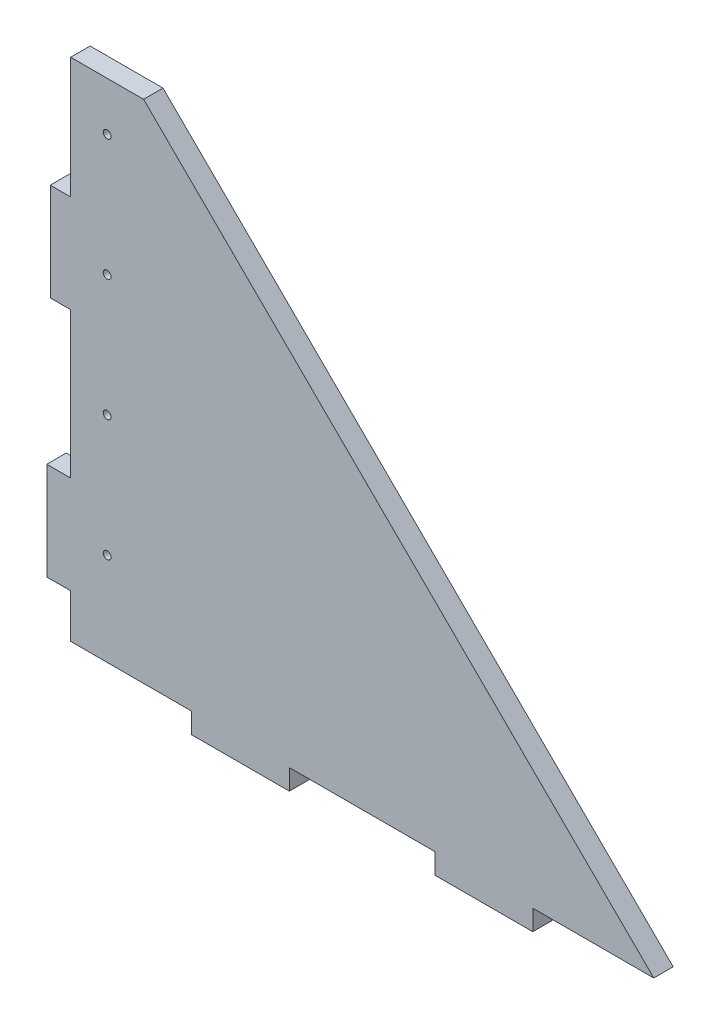
ISO-10303-21;
HEADER;
FILE_DESCRIPTION(('STEP AP214'),'2;1');
FILE_NAME('part.step','',(''),(''),'','','');
FILE_SCHEMA(('AUTOMOTIVE_DESIGN { 1 0 10303 214 1 1 1 1 }'));
ENDSEC;
DATA;
#1=APPLICATION_CONTEXT('core data for automotive mechanical design processes');
#2=APPLICATION_PROTOCOL_DEFINITION('international standard','automotive_design',2000,#1);
#3=PRODUCT_CONTEXT('',#1,'mechanical');
#4=PRODUCT('Part','Part','',(#3));
#5=PRODUCT_RELATED_PRODUCT_CATEGORY('part','',(#4));
#6=PRODUCT_DEFINITION_FORMATION('','',#4);
#7=PRODUCT_DEFINITION_CONTEXT('part definition',#1,'design');
#8=PRODUCT_DEFINITION('design','',#6,#7);
#9=PRODUCT_DEFINITION_SHAPE('','',#8);
#10=(LENGTH_UNIT() NAMED_UNIT(*) SI_UNIT(.MILLI.,.METRE.));
#11=(NAMED_UNIT(*) PLANE_ANGLE_UNIT() SI_UNIT($,.RADIAN.));
#12=(NAMED_UNIT(*) SI_UNIT($,.STERADIAN.) SOLID_ANGLE_UNIT());
#13=UNCERTAINTY_MEASURE_WITH_UNIT(LENGTH_MEASURE(1.E-05),#10,'distance_accuracy_value','');
#14=(GEOMETRIC_REPRESENTATION_CONTEXT(3) GLOBAL_UNCERTAINTY_ASSIGNED_CONTEXT((#13)) GLOBAL_UNIT_ASSIGNED_CONTEXT((#10,
#11,#12)) REPRESENTATION_CONTEXT('',''));
#15=CARTESIAN_POINT('',(0.,0.,0.));
#16=DIRECTION('',(0.,0.,1.));
#17=DIRECTION('',(1.,0.,0.));
#18=AXIS2_PLACEMENT_3D('',#15,#16,#17);
#19=CARTESIAN_POINT('',(0.,0.,4.));
#20=DIRECTION('',(0.,1.,0.));
#21=DIRECTION('',(0.,0.,1.));
#22=AXIS2_PLACEMENT_3D('',#19,#20,#21);
#23=PLANE('',#22);
#24=DIRECTION('',(1.,0.,0.));
#25=VECTOR('',#24,1.);
#26=CARTESIAN_POINT('',(0.,0.,0.));
#27=LINE('',#26,#25);
#28=CARTESIAN_POINT('',(0.,0.,0.));
#29=VERTEX_POINT('',#28);
#30=CARTESIAN_POINT('',(24.9,0.,0.));
#31=VERTEX_POINT('',#30);
#32=EDGE_CURVE('E204',#29,#31,#27,.T.);
#33=ORIENTED_EDGE('',*,*,#32,.T.);
#34=DIRECTION('',(0.,0.,-1.));
#35=VECTOR('',#34,1.);
#36=CARTESIAN_POINT('',(24.9,0.,4.));
#37=LINE('',#36,#35);
#38=CARTESIAN_POINT('',(24.9,0.,4.));
#39=VERTEX_POINT('',#38);
#40=EDGE_CURVE('E292',#39,#31,#37,.T.);
#41=ORIENTED_EDGE('',*,*,#40,.F.);
#42=DIRECTION('',(1.,0.,0.));
#43=VECTOR('',#42,1.);
#44=CARTESIAN_POINT('',(0.,0.,4.));
#45=LINE('',#44,#43);
#46=CARTESIAN_POINT('',(0.,0.,4.));
#47=VERTEX_POINT('',#46);
#48=EDGE_CURVE('E243',#47,#39,#45,.T.);
#49=ORIENTED_EDGE('',*,*,#48,.F.);
#50=DIRECTION('',(0.,0.,-1.));
#51=VECTOR('',#50,1.);
#52=CARTESIAN_POINT('',(0.,0.,4.));
#53=LINE('',#52,#51);
#54=EDGE_CURVE('E200',#47,#29,#53,.T.);
#55=ORIENTED_EDGE('',*,*,#54,.T.);
#56=EDGE_LOOP('',(#33,#41,#49,#55));
#57=FACE_BOUND('',#56,.T.);
#58=ADVANCED_FACE('F33',(#57),#23,.F.);
#59=CARTESIAN_POINT('',(24.9,-4.2,4.));
#60=DIRECTION('',(1.,0.,0.));
#61=DIRECTION('',(0.,0.,-1.));
#62=AXIS2_PLACEMENT_3D('',#59,#60,#61);
#63=PLANE('',#62);
#64=DIRECTION('',(0.,-1.,0.));
#65=VECTOR('',#64,1.);
#66=CARTESIAN_POINT('',(24.9,-4.2,0.));
#67=LINE('',#66,#65);
#68=CARTESIAN_POINT('',(24.9,-4.2,0.));
#69=VERTEX_POINT('',#68);
#70=EDGE_CURVE('E207',#31,#69,#67,.T.);
#71=ORIENTED_EDGE('',*,*,#70,.T.);
#72=DIRECTION('',(0.,0.,-1.));
#73=VECTOR('',#72,1.);
#74=CARTESIAN_POINT('',(24.9,-4.2,4.));
#75=LINE('',#74,#73);
#76=CARTESIAN_POINT('',(24.9,-4.2,4.));
#77=VERTEX_POINT('',#76);
#78=EDGE_CURVE('E289',#77,#69,#75,.T.);
#79=ORIENTED_EDGE('',*,*,#78,.F.);
#80=DIRECTION('',(0.,-1.,0.));
#81=VECTOR('',#80,1.);
#82=CARTESIAN_POINT('',(24.9,-4.2,4.));
#83=LINE('',#82,#81);
#84=EDGE_CURVE('E130',#39,#77,#83,.T.);
#85=ORIENTED_EDGE('',*,*,#84,.F.);
#86=ORIENTED_EDGE('',*,*,#40,.T.);
#87=EDGE_LOOP('',(#71,#79,#85,#86));
#88=FACE_BOUND('',#87,.T.);
#89=ADVANCED_FACE('F326',(#88),#63,.F.);
#90=CARTESIAN_POINT('',(24.9,-4.2,4.));
#91=DIRECTION('',(0.,1.,0.));
#92=DIRECTION('',(0.,0.,1.));
#93=AXIS2_PLACEMENT_3D('',#90,#91,#92);
#94=PLANE('',#93);
#95=DIRECTION('',(1.,0.,0.));
#96=VECTOR('',#95,1.);
#97=CARTESIAN_POINT('',(24.9,-4.2,0.));
#98=LINE('',#97,#96);
#99=CARTESIAN_POINT('',(45.,-4.2,0.));
#100=VERTEX_POINT('',#99);
#101=EDGE_CURVE('E210',#69,#100,#98,.T.);
#102=ORIENTED_EDGE('',*,*,#101,.T.);
#103=DIRECTION('',(0.,0.,-1.));
#104=VECTOR('',#103,1.);
#105=CARTESIAN_POINT('',(45.,-4.2,4.));
#106=LINE('',#105,#104);
#107=CARTESIAN_POINT('',(45.,-4.2,4.));
#108=VERTEX_POINT('',#107);
#109=EDGE_CURVE('E286',#108,#100,#106,.T.);
#110=ORIENTED_EDGE('',*,*,#109,.F.);
#111=DIRECTION('',(1.,0.,0.));
#112=VECTOR('',#111,1.);
#113=CARTESIAN_POINT('',(24.9,-4.2,4.));
#114=LINE('',#113,#112);
#115=EDGE_CURVE('E367',#77,#108,#114,.T.);
#116=ORIENTED_EDGE('',*,*,#115,.F.);
#117=ORIENTED_EDGE('',*,*,#78,.T.);
#118=EDGE_LOOP('',(#102,#110,#116,#117));
#119=FACE_BOUND('',#118,.T.);
#120=ADVANCED_FACE('F332',(#119),#94,.F.);
#121=CARTESIAN_POINT('',(45.,-4.2,4.));
#122=DIRECTION('',(-1.,0.,0.));
#123=DIRECTION('',(0.,-1.,0.));
#124=AXIS2_PLACEMENT_3D('',#121,#122,#123);
#125=PLANE('',#124);
#126=DIRECTION('',(0.,1.,0.));
#127=VECTOR('',#126,1.);
#128=CARTESIAN_POINT('',(45.,-4.2,0.));
#129=LINE('',#128,#127);
#130=CARTESIAN_POINT('',(45.,0.,0.));
#131=VERTEX_POINT('',#130);
#132=EDGE_CURVE('E212',#100,#131,#129,.T.);
#133=ORIENTED_EDGE('',*,*,#132,.T.);
#134=DIRECTION('',(0.,0.,-1.));
#135=VECTOR('',#134,1.);
#136=CARTESIAN_POINT('',(45.,0.,4.));
#137=LINE('',#136,#135);
#138=CARTESIAN_POINT('',(45.,0.,4.));
#139=VERTEX_POINT('',#138);
#140=EDGE_CURVE('E283',#139,#131,#137,.T.);
#141=ORIENTED_EDGE('',*,*,#140,.F.);
#142=DIRECTION('',(0.,1.,0.));
#143=VECTOR('',#142,1.);
#144=CARTESIAN_POINT('',(45.,-4.2,4.));
#145=LINE('',#144,#143);
#146=EDGE_CURVE('E369',#108,#139,#145,.T.);
#147=ORIENTED_EDGE('',*,*,#146,.F.);
#148=ORIENTED_EDGE('',*,*,#109,.T.);
#149=EDGE_LOOP('',(#133,#141,#147,#148));
#150=FACE_BOUND('',#149,.T.);
#151=ADVANCED_FACE('F416',(#150),#125,.F.);
#152=CARTESIAN_POINT('',(45.,0.,4.));
#153=DIRECTION('',(0.,1.,0.));
#154=DIRECTION('',(0.,0.,1.));
#155=AXIS2_PLACEMENT_3D('',#152,#153,#154);
#156=PLANE('',#155);
#157=DIRECTION('',(1.,0.,0.));
#158=VECTOR('',#157,1.);
#159=CARTESIAN_POINT('',(45.,0.,0.));
#160=LINE('',#159,#158);
#161=CARTESIAN_POINT('',(75.,0.,0.));
#162=VERTEX_POINT('',#161);
#163=EDGE_CURVE('E214',#131,#162,#160,.T.);
#164=ORIENTED_EDGE('',*,*,#163,.T.);
#165=DIRECTION('',(0.,0.,-1.));
#166=VECTOR('',#165,1.);
#167=CARTESIAN_POINT('',(75.,0.,4.));
#168=LINE('',#167,#166);
#169=CARTESIAN_POINT('',(75.,0.,4.));
#170=VERTEX_POINT('',#169);
#171=EDGE_CURVE('E280',#170,#162,#168,.T.);
#172=ORIENTED_EDGE('',*,*,#171,.F.);
#173=DIRECTION('',(1.,0.,0.));
#174=VECTOR('',#173,1.);
#175=CARTESIAN_POINT('',(45.,0.,4.));
#176=LINE('',#175,#174);
#177=EDGE_CURVE('E371',#139,#170,#176,.T.);
#178=ORIENTED_EDGE('',*,*,#177,.F.);
#179=ORIENTED_EDGE('',*,*,#140,.T.);
#180=EDGE_LOOP('',(#164,#172,#178,#179));
#181=FACE_BOUND('',#180,.T.);
#182=ADVANCED_FACE('F422',(#181),#156,.F.);
#183=CARTESIAN_POINT('',(75.,0.,4.));
#184=DIRECTION('',(1.,0.,0.));
#185=DIRECTION('',(0.,0.,-1.));
#186=AXIS2_PLACEMENT_3D('',#183,#184,#185);
#187=PLANE('',#186);
#188=DIRECTION('',(0.,-1.,0.));
#189=VECTOR('',#188,1.);
#190=CARTESIAN_POINT('',(75.,0.,0.));
#191=LINE('',#190,#189);
#192=CARTESIAN_POINT('',(75.,-4.2,0.));
#193=VERTEX_POINT('',#192);
#194=EDGE_CURVE('E216',#162,#193,#191,.T.);
#195=ORIENTED_EDGE('',*,*,#194,.T.);
#196=DIRECTION('',(0.,0.,-1.));
#197=VECTOR('',#196,1.);
#198=CARTESIAN_POINT('',(75.,-4.2,4.));
#199=LINE('',#198,#197);
#200=CARTESIAN_POINT('',(75.,-4.2,4.));
#201=VERTEX_POINT('',#200);
#202=EDGE_CURVE('E277',#201,#193,#199,.T.);
#203=ORIENTED_EDGE('',*,*,#202,.F.);
#204=DIRECTION('',(0.,-1.,0.));
#205=VECTOR('',#204,1.);
#206=CARTESIAN_POINT('',(75.,0.,4.));
#207=LINE('',#206,#205);
#208=EDGE_CURVE('E373',#170,#201,#207,.T.);
#209=ORIENTED_EDGE('',*,*,#208,.F.);
#210=ORIENTED_EDGE('',*,*,#171,.T.);
#211=EDGE_LOOP('',(#195,#203,#209,#210));
#212=FACE_BOUND('',#211,.T.);
#213=ADVANCED_FACE('F426',(#212),#187,.F.);
#214=CARTESIAN_POINT('',(75.,-4.2,4.));
#215=DIRECTION('',(0.,1.,0.));
#216=DIRECTION('',(-1.,0.,0.));
#217=AXIS2_PLACEMENT_3D('',#214,#215,#216);
#218=PLANE('',#217);
#219=DIRECTION('',(1.,0.,0.));
#220=VECTOR('',#219,1.);
#221=CARTESIAN_POINT('',(75.,-4.2,0.));
#222=LINE('',#221,#220);
#223=CARTESIAN_POINT('',(95.1,-4.2,0.));
#224=VERTEX_POINT('',#223);
#225=EDGE_CURVE('E218',#193,#224,#222,.T.);
#226=ORIENTED_EDGE('',*,*,#225,.T.);
#227=DIRECTION('',(0.,0.,-1.));
#228=VECTOR('',#227,1.);
#229=CARTESIAN_POINT('',(95.1,-4.2,4.));
#230=LINE('',#229,#228);
#231=CARTESIAN_POINT('',(95.1,-4.2,4.));
#232=VERTEX_POINT('',#231);
#233=EDGE_CURVE('E274',#232,#224,#230,.T.);
#234=ORIENTED_EDGE('',*,*,#233,.F.);
#235=DIRECTION('',(1.,0.,0.));
#236=VECTOR('',#235,1.);
#237=CARTESIAN_POINT('',(75.,-4.2,4.));
#238=LINE('',#237,#236);
#239=EDGE_CURVE('E375',#201,#232,#238,.T.);
#240=ORIENTED_EDGE('',*,*,#239,.F.);
#241=ORIENTED_EDGE('',*,*,#202,.T.);
#242=EDGE_LOOP('',(#226,#234,#240,#241));
#243=FACE_BOUND('',#242,.T.);
#244=ADVANCED_FACE('F431',(#243),#218,.F.);
#245=CARTESIAN_POINT('',(95.1,0.,4.));
#246=DIRECTION('',(-1.,0.,0.));
#247=DIRECTION('',(0.,0.,1.));
#248=AXIS2_PLACEMENT_3D('',#245,#246,#247);
#249=PLANE('',#248);
#250=DIRECTION('',(0.,1.,0.));
#251=VECTOR('',#250,1.);
#252=CARTESIAN_POINT('',(95.1,0.,0.));
#253=LINE('',#252,#251);
#254=CARTESIAN_POINT('',(95.1,0.,0.));
#255=VERTEX_POINT('',#254);
#256=EDGE_CURVE('E220',#224,#255,#253,.T.);
#257=ORIENTED_EDGE('',*,*,#256,.T.);
#258=DIRECTION('',(0.,0.,-1.));
#259=VECTOR('',#258,1.);
#260=CARTESIAN_POINT('',(95.1,0.,4.));
#261=LINE('',#260,#259);
#262=CARTESIAN_POINT('',(95.1,0.,4.));
#263=VERTEX_POINT('',#262);
#264=EDGE_CURVE('E271',#263,#255,#261,.T.);
#265=ORIENTED_EDGE('',*,*,#264,.F.);
#266=DIRECTION('',(0.,1.,0.));
#267=VECTOR('',#266,1.);
#268=CARTESIAN_POINT('',(95.1,0.,4.));
#269=LINE('',#268,#267);
#270=EDGE_CURVE('E377',#232,#263,#269,.T.);
#271=ORIENTED_EDGE('',*,*,#270,.F.);
#272=ORIENTED_EDGE('',*,*,#233,.T.);
#273=EDGE_LOOP('',(#257,#265,#271,#272));
#274=FACE_BOUND('',#273,.T.);
#275=ADVANCED_FACE('F437',(#274),#249,.F.);
#276=CARTESIAN_POINT('',(95.1,0.,4.));
#277=DIRECTION('',(0.,1.,0.));
#278=DIRECTION('',(-1.,0.,0.));
#279=AXIS2_PLACEMENT_3D('',#276,#277,#278);
#280=PLANE('',#279);
#281=DIRECTION('',(1.,0.,0.));
#282=VECTOR('',#281,1.);
#283=CARTESIAN_POINT('',(95.1,0.,0.));
#284=LINE('',#283,#282);
#285=CARTESIAN_POINT('',(120.,0.,0.));
#286=VERTEX_POINT('',#285);
#287=EDGE_CURVE('E222',#255,#286,#284,.T.);
#288=ORIENTED_EDGE('',*,*,#287,.T.);
#289=DIRECTION('',(0.,0.,-1.));
#290=VECTOR('',#289,1.);
#291=CARTESIAN_POINT('',(120.,0.,4.));
#292=LINE('',#291,#290);
#293=CARTESIAN_POINT('',(120.,0.,4.));
#294=VERTEX_POINT('',#293);
#295=EDGE_CURVE('E268',#294,#286,#292,.T.);
#296=ORIENTED_EDGE('',*,*,#295,.F.);
#297=DIRECTION('',(1.,0.,0.));
#298=VECTOR('',#297,1.);
#299=CARTESIAN_POINT('',(95.1,0.,4.));
#300=LINE('',#299,#298);
#301=EDGE_CURVE('E379',#263,#294,#300,.T.);
#302=ORIENTED_EDGE('',*,*,#301,.F.);
#303=ORIENTED_EDGE('',*,*,#264,.T.);
#304=EDGE_LOOP('',(#288,#296,#302,#303));
#305=FACE_BOUND('',#304,.T.);
#306=ADVANCED_FACE('F441',(#305),#280,.F.);
#307=CARTESIAN_POINT('',(15.,104.11,4.));
#308=DIRECTION('',(-0.704090863426999,-0.710109890114638,0.));
#309=DIRECTION('',(0.710109890114638,-0.704090863426999,0.));
#310=AXIS2_PLACEMENT_3D('',#307,#308,#309);
#311=PLANE('',#310);
#312=DIRECTION('',(-0.710109890114638,0.704090863426999,0.));
#313=VECTOR('',#312,1.);
#314=CARTESIAN_POINT('',(15.,104.11,0.));
#315=LINE('',#314,#313);
#316=CARTESIAN_POINT('',(15.,104.11,0.));
#317=VERTEX_POINT('',#316);
#318=EDGE_CURVE('E224',#286,#317,#315,.T.);
#319=ORIENTED_EDGE('',*,*,#318,.T.);
#320=DIRECTION('',(0.,0.,-1.));
#321=VECTOR('',#320,1.);
#322=CARTESIAN_POINT('',(15.,104.11,4.));
#323=LINE('',#322,#321);
#324=CARTESIAN_POINT('',(15.,104.11,4.));
#325=VERTEX_POINT('',#324);
#326=EDGE_CURVE('E265',#325,#317,#323,.T.);
#327=ORIENTED_EDGE('',*,*,#326,.F.);
#328=DIRECTION('',(-0.710109890114638,0.704090863426999,0.));
#329=VECTOR('',#328,1.);
#330=CARTESIAN_POINT('',(15.,104.11,4.));
#331=LINE('',#330,#329);
#332=EDGE_CURVE('E381',#294,#325,#331,.T.);
#333=ORIENTED_EDGE('',*,*,#332,.F.);
#334=ORIENTED_EDGE('',*,*,#295,.T.);
#335=EDGE_LOOP('',(#319,#327,#333,#334));
#336=FACE_BOUND('',#335,.T.);
#337=ADVANCED_FACE('F446',(#336),#311,.F.);
#338=CARTESIAN_POINT('',(0.,104.11,4.));
#339=DIRECTION('',(0.,-1.,0.));
#340=DIRECTION('',(0.,0.,-1.));
#341=AXIS2_PLACEMENT_3D('',#338,#339,#340);
#342=PLANE('',#341);
#343=DIRECTION('',(-1.,0.,0.));
#344=VECTOR('',#343,1.);
#345=CARTESIAN_POINT('',(0.,104.11,0.));
#346=LINE('',#345,#344);
#347=CARTESIAN_POINT('',(0.,104.11,0.));
#348=VERTEX_POINT('',#347);
#349=EDGE_CURVE('E226',#317,#348,#346,.T.);
#350=ORIENTED_EDGE('',*,*,#349,.T.);
#351=DIRECTION('',(0.,0.,-1.));
#352=VECTOR('',#351,1.);
#353=CARTESIAN_POINT('',(0.,104.11,4.));
#354=LINE('',#353,#352);
#355=CARTESIAN_POINT('',(0.,104.11,4.));
#356=VERTEX_POINT('',#355);
#357=EDGE_CURVE('E262',#356,#348,#354,.T.);
#358=ORIENTED_EDGE('',*,*,#357,.F.);
#359=DIRECTION('',(-1.,0.,0.));
#360=VECTOR('',#359,1.);
#361=CARTESIAN_POINT('',(0.,104.11,4.));
#362=LINE('',#361,#360);
#363=EDGE_CURVE('E383',#325,#356,#362,.T.);
#364=ORIENTED_EDGE('',*,*,#363,.F.);
#365=ORIENTED_EDGE('',*,*,#326,.T.);
#366=EDGE_LOOP('',(#350,#358,#364,#365));
#367=FACE_BOUND('',#366,.T.);
#368=ADVANCED_FACE('F452',(#367),#342,.F.);
#369=CARTESIAN_POINT('',(0.,79.21,4.));
#370=DIRECTION('',(1.,0.,0.));
#371=DIRECTION('',(0.,0.,-1.));
#372=AXIS2_PLACEMENT_3D('',#369,#370,#371);
#373=PLANE('',#372);
#374=DIRECTION('',(0.,-1.,0.));
#375=VECTOR('',#374,1.);
#376=CARTESIAN_POINT('',(0.,79.21,0.));
#377=LINE('',#376,#375);
#378=CARTESIAN_POINT('',(0.,79.21,0.));
#379=VERTEX_POINT('',#378);
#380=EDGE_CURVE('E228',#348,#379,#377,.T.);
#381=ORIENTED_EDGE('',*,*,#380,.T.);
#382=DIRECTION('',(0.,0.,-1.));
#383=VECTOR('',#382,1.);
#384=CARTESIAN_POINT('',(0.,79.21,4.));
#385=LINE('',#384,#383);
#386=CARTESIAN_POINT('',(0.,79.21,4.));
#387=VERTEX_POINT('',#386);
#388=EDGE_CURVE('E259',#387,#379,#385,.T.);
#389=ORIENTED_EDGE('',*,*,#388,.F.);
#390=DIRECTION('',(0.,-1.,0.));
#391=VECTOR('',#390,1.);
#392=CARTESIAN_POINT('',(0.,79.21,4.));
#393=LINE('',#392,#391);
#394=EDGE_CURVE('E385',#356,#387,#393,.T.);
#395=ORIENTED_EDGE('',*,*,#394,.F.);
#396=ORIENTED_EDGE('',*,*,#357,.T.);
#397=EDGE_LOOP('',(#381,#389,#395,#396));
#398=FACE_BOUND('',#397,.T.);
#399=ADVANCED_FACE('F456',(#398),#373,.F.);
#400=CARTESIAN_POINT('',(0.,79.21,4.));
#401=DIRECTION('',(0.,-1.,0.));
#402=DIRECTION('',(0.,0.,-1.));
#403=AXIS2_PLACEMENT_3D('',#400,#401,#402);
#404=PLANE('',#403);
#405=DIRECTION('',(-1.,0.,0.));
#406=VECTOR('',#405,1.);
#407=CARTESIAN_POINT('',(0.,79.21,0.));
#408=LINE('',#407,#406);
#409=CARTESIAN_POINT('',(-4.2,79.21,0.));
#410=VERTEX_POINT('',#409);
#411=EDGE_CURVE('E230',#379,#410,#408,.T.);
#412=ORIENTED_EDGE('',*,*,#411,.T.);
#413=DIRECTION('',(0.,0.,-1.));
#414=VECTOR('',#413,1.);
#415=CARTESIAN_POINT('',(-4.2,79.21,4.));
#416=LINE('',#415,#414);
#417=CARTESIAN_POINT('',(-4.2,79.21,4.));
#418=VERTEX_POINT('',#417);
#419=EDGE_CURVE('E256',#418,#410,#416,.T.);
#420=ORIENTED_EDGE('',*,*,#419,.F.);
#421=DIRECTION('',(-1.,0.,0.));
#422=VECTOR('',#421,1.);
#423=CARTESIAN_POINT('',(0.,79.21,4.));
#424=LINE('',#423,#422);
#425=EDGE_CURVE('E387',#387,#418,#424,.T.);
#426=ORIENTED_EDGE('',*,*,#425,.F.);
#427=ORIENTED_EDGE('',*,*,#388,.T.);
#428=EDGE_LOOP('',(#412,#420,#426,#427));
#429=FACE_BOUND('',#428,.T.);
#430=ADVANCED_FACE('F461',(#429),#404,.F.);
#431=CARTESIAN_POINT('',(-4.2,59.11,4.));
#432=DIRECTION('',(1.,0.,0.));
#433=DIRECTION('',(0.,0.,-1.));
#434=AXIS2_PLACEMENT_3D('',#431,#432,#433);
#435=PLANE('',#434);
#436=DIRECTION('',(0.,-1.,0.));
#437=VECTOR('',#436,1.);
#438=CARTESIAN_POINT('',(-4.2,59.11,0.));
#439=LINE('',#438,#437);
#440=CARTESIAN_POINT('',(-4.2,59.11,0.));
#441=VERTEX_POINT('',#440);
#442=EDGE_CURVE('E232',#410,#441,#439,.T.);
#443=ORIENTED_EDGE('',*,*,#442,.T.);
#444=DIRECTION('',(0.,0.,-1.));
#445=VECTOR('',#444,1.);
#446=CARTESIAN_POINT('',(-4.2,59.11,4.));
#447=LINE('',#446,#445);
#448=CARTESIAN_POINT('',(-4.2,59.11,4.));
#449=VERTEX_POINT('',#448);
#450=EDGE_CURVE('E253',#449,#441,#447,.T.);
#451=ORIENTED_EDGE('',*,*,#450,.F.);
#452=DIRECTION('',(0.,-1.,0.));
#453=VECTOR('',#452,1.);
#454=CARTESIAN_POINT('',(-4.2,59.11,4.));
#455=LINE('',#454,#453);
#456=EDGE_CURVE('E389',#418,#449,#455,.T.);
#457=ORIENTED_EDGE('',*,*,#456,.F.);
#458=ORIENTED_EDGE('',*,*,#419,.T.);
#459=EDGE_LOOP('',(#443,#451,#457,#458));
#460=FACE_BOUND('',#459,.T.);
#461=ADVANCED_FACE('F465',(#460),#435,.F.);
#462=CARTESIAN_POINT('',(0.,59.11,4.));
#463=DIRECTION('',(0.,1.,0.));
#464=DIRECTION('',(0.,0.,1.));
#465=AXIS2_PLACEMENT_3D('',#462,#463,#464);
#466=PLANE('',#465);
#467=DIRECTION('',(1.,0.,0.));
#468=VECTOR('',#467,1.);
#469=CARTESIAN_POINT('',(0.,59.11,0.));
#470=LINE('',#469,#468);
#471=CARTESIAN_POINT('',(0.,59.11,0.));
#472=VERTEX_POINT('',#471);
#473=EDGE_CURVE('E234',#441,#472,#470,.T.);
#474=ORIENTED_EDGE('',*,*,#473,.T.);
#475=DIRECTION('',(0.,0.,-1.));
#476=VECTOR('',#475,1.);
#477=CARTESIAN_POINT('',(0.,59.11,4.));
#478=LINE('',#477,#476);
#479=CARTESIAN_POINT('',(0.,59.11,4.));
#480=VERTEX_POINT('',#479);
#481=EDGE_CURVE('E250',#480,#472,#478,.T.);
#482=ORIENTED_EDGE('',*,*,#481,.F.);
#483=DIRECTION('',(1.,0.,0.));
#484=VECTOR('',#483,1.);
#485=CARTESIAN_POINT('',(0.,59.11,4.));
#486=LINE('',#485,#484);
#487=EDGE_CURVE('E391',#449,#480,#486,.T.);
#488=ORIENTED_EDGE('',*,*,#487,.F.);
#489=ORIENTED_EDGE('',*,*,#450,.T.);
#490=EDGE_LOOP('',(#474,#482,#488,#489));
#491=FACE_BOUND('',#490,.T.);
#492=ADVANCED_FACE('F469',(#491),#466,.F.);
#493=CARTESIAN_POINT('',(0.,29.11,4.));
#494=DIRECTION('',(1.,0.,0.));
#495=DIRECTION('',(0.,0.,-1.));
#496=AXIS2_PLACEMENT_3D('',#493,#494,#495);
#497=PLANE('',#496);
#498=DIRECTION('',(0.,-1.,0.));
#499=VECTOR('',#498,1.);
#500=CARTESIAN_POINT('',(0.,29.11,0.));
#501=LINE('',#500,#499);
#502=CARTESIAN_POINT('',(0.,29.11,0.));
#503=VERTEX_POINT('',#502);
#504=EDGE_CURVE('E236',#472,#503,#501,.T.);
#505=ORIENTED_EDGE('',*,*,#504,.T.);
#506=DIRECTION('',(0.,0.,-1.));
#507=VECTOR('',#506,1.);
#508=CARTESIAN_POINT('',(0.,29.11,4.));
#509=LINE('',#508,#507);
#510=CARTESIAN_POINT('',(0.,29.11,4.));
#511=VERTEX_POINT('',#510);
#512=EDGE_CURVE('E247',#511,#503,#509,.T.);
#513=ORIENTED_EDGE('',*,*,#512,.F.);
#514=DIRECTION('',(0.,-1.,0.));
#515=VECTOR('',#514,1.);
#516=CARTESIAN_POINT('',(0.,29.11,4.));
#517=LINE('',#516,#515);
#518=EDGE_CURVE('E393',#480,#511,#517,.T.);
#519=ORIENTED_EDGE('',*,*,#518,.F.);
#520=ORIENTED_EDGE('',*,*,#481,.T.);
#521=EDGE_LOOP('',(#505,#513,#519,#520));
#522=FACE_BOUND('',#521,.T.);
#523=ADVANCED_FACE('F399',(#522),#497,.F.);
#524=CARTESIAN_POINT('',(-4.9131679733182,29.11,4.));
#525=DIRECTION('',(0.,-1.,0.));
#526=DIRECTION('',(0.,0.,-1.));
#527=AXIS2_PLACEMENT_3D('',#524,#525,#526);
#528=PLANE('',#527);
#529=DIRECTION('',(-1.,0.,0.));
#530=VECTOR('',#529,1.);
#531=CARTESIAN_POINT('',(-4.9131679733182,29.11,0.));
#532=LINE('',#531,#530);
#533=CARTESIAN_POINT('',(-4.9131679733182,29.11,0.));
#534=VERTEX_POINT('',#533);
#535=EDGE_CURVE('E238',#503,#534,#532,.T.);
#536=ORIENTED_EDGE('',*,*,#535,.T.);
#537=DIRECTION('',(0.,0.,-1.));
#538=VECTOR('',#537,1.);
#539=CARTESIAN_POINT('',(-4.9131679733182,29.11,4.));
#540=LINE('',#539,#538);
#541=CARTESIAN_POINT('',(-4.9131679733182,29.11,4.));
#542=VERTEX_POINT('',#541);
#543=EDGE_CURVE('E195',#542,#534,#540,.T.);
#544=ORIENTED_EDGE('',*,*,#543,.F.);
#545=DIRECTION('',(-1.,0.,0.));
#546=VECTOR('',#545,1.);
#547=CARTESIAN_POINT('',(-4.9131679733182,29.11,4.));
#548=LINE('',#547,#546);
#549=EDGE_CURVE('E186',#511,#542,#548,.T.);
#550=ORIENTED_EDGE('',*,*,#549,.F.);
#551=ORIENTED_EDGE('',*,*,#512,.T.);
#552=EDGE_LOOP('',(#536,#544,#550,#551));
#553=FACE_BOUND('',#552,.T.);
#554=ADVANCED_FACE('F403',(#553),#528,.F.);
#555=CARTESIAN_POINT('',(-4.9131679733182,9.01,4.));
#556=DIRECTION('',(1.,0.,0.));
#557=DIRECTION('',(0.,0.,-1.));
#558=AXIS2_PLACEMENT_3D('',#555,#556,#557);
#559=PLANE('',#558);
#560=DIRECTION('',(0.,-1.,0.));
#561=VECTOR('',#560,1.);
#562=CARTESIAN_POINT('',(-4.9131679733182,9.01,0.));
#563=LINE('',#562,#561);
#564=CARTESIAN_POINT('',(-4.9131679733182,9.01,0.));
#565=VERTEX_POINT('',#564);
#566=EDGE_CURVE('E194',#534,#565,#563,.T.);
#567=ORIENTED_EDGE('',*,*,#566,.T.);
#568=DIRECTION('',(0.,0.,-1.));
#569=VECTOR('',#568,1.);
#570=CARTESIAN_POINT('',(-4.9131679733182,9.01,4.));
#571=LINE('',#570,#569);
#572=CARTESIAN_POINT('',(-4.9131679733182,9.01,4.));
#573=VERTEX_POINT('',#572);
#574=EDGE_CURVE('E191',#573,#565,#571,.T.);
#575=ORIENTED_EDGE('',*,*,#574,.F.);
#576=DIRECTION('',(0.,-1.,0.));
#577=VECTOR('',#576,1.);
#578=CARTESIAN_POINT('',(-4.9131679733182,9.01,4.));
#579=LINE('',#578,#577);
#580=EDGE_CURVE('E179',#542,#573,#579,.T.);
#581=ORIENTED_EDGE('',*,*,#580,.F.);
#582=ORIENTED_EDGE('',*,*,#543,.T.);
#583=EDGE_LOOP('',(#567,#575,#581,#582));
#584=FACE_BOUND('',#583,.T.);
#585=ADVANCED_FACE('F192',(#584),#559,.F.);
#586=CARTESIAN_POINT('',(-4.9131679733182,9.01,4.));
#587=DIRECTION('',(0.,1.,0.));
#588=DIRECTION('',(0.,0.,1.));
#589=AXIS2_PLACEMENT_3D('',#586,#587,#588);
#590=PLANE('',#589);
#591=DIRECTION('',(1.,0.,0.));
#592=VECTOR('',#591,1.);
#593=CARTESIAN_POINT('',(-4.9131679733182,9.01,0.));
#594=LINE('',#593,#592);
#595=CARTESIAN_POINT('',(0.,9.01,0.));
#596=VERTEX_POINT('',#595);
#597=EDGE_CURVE('E115',#565,#596,#594,.T.);
#598=ORIENTED_EDGE('',*,*,#597,.T.);
#599=DIRECTION('',(0.,0.,-1.));
#600=VECTOR('',#599,1.);
#601=CARTESIAN_POINT('',(0.,9.01,4.));
#602=LINE('',#601,#600);
#603=CARTESIAN_POINT('',(0.,9.01,4.));
#604=VERTEX_POINT('',#603);
#605=EDGE_CURVE('E196',#604,#596,#602,.T.);
#606=ORIENTED_EDGE('',*,*,#605,.F.);
#607=DIRECTION('',(1.,0.,0.));
#608=VECTOR('',#607,1.);
#609=CARTESIAN_POINT('',(-4.9131679733182,9.01,4.));
#610=LINE('',#609,#608);
#611=EDGE_CURVE('E184',#573,#604,#610,.T.);
#612=ORIENTED_EDGE('',*,*,#611,.F.);
#613=ORIENTED_EDGE('',*,*,#574,.T.);
#614=EDGE_LOOP('',(#598,#606,#612,#613));
#615=FACE_BOUND('',#614,.T.);
#616=ADVANCED_FACE('F198',(#615),#590,.F.);
#617=CARTESIAN_POINT('',(0.,0.,4.));
#618=DIRECTION('',(1.,0.,0.));
#619=DIRECTION('',(0.,0.,-1.));
#620=AXIS2_PLACEMENT_3D('',#617,#618,#619);
#621=PLANE('',#620);
#622=DIRECTION('',(0.,-1.,0.));
#623=VECTOR('',#622,1.);
#624=CARTESIAN_POINT('',(0.,0.,0.));
#625=LINE('',#624,#623);
#626=EDGE_CURVE('E121',#596,#29,#625,.T.);
#627=ORIENTED_EDGE('',*,*,#626,.T.);
#628=ORIENTED_EDGE('',*,*,#54,.F.);
#629=DIRECTION('',(0.,-1.,0.));
#630=VECTOR('',#629,1.);
#631=CARTESIAN_POINT('',(0.,0.,4.));
#632=LINE('',#631,#630);
#633=EDGE_CURVE('E50',#604,#47,#632,.T.);
#634=ORIENTED_EDGE('',*,*,#633,.F.);
#635=ORIENTED_EDGE('',*,*,#605,.T.);
#636=EDGE_LOOP('',(#627,#628,#634,#635));
#637=FACE_BOUND('',#636,.T.);
#638=ADVANCED_FACE('F310',(#637),#621,.F.);
#639=CARTESIAN_POINT('',(0.,0.,4.));
#640=DIRECTION('',(0.,0.,1.));
#641=DIRECTION('',(1.,0.,0.));
#642=AXIS2_PLACEMENT_3D('',#639,#640,#641);
#643=PLANE('',#642);
#644=CARTESIAN_POINT('',(7.5,69.11,4.));
#645=DIRECTION('',(0.,0.,1.));
#646=DIRECTION('',(1.,0.,0.));
#647=AXIS2_PLACEMENT_3D('',#644,#645,#646);
#648=CIRCLE('',#647,0.799999999999998);
#649=CARTESIAN_POINT('',(8.3,69.11,4.));
#650=VERTEX_POINT('',#649);
#651=EDGE_CURVE('E356',#650,#650,#648,.T.);
#652=ORIENTED_EDGE('',*,*,#651,.F.);
#653=EDGE_LOOP('',(#652));
#654=FACE_BOUND('',#653,.T.);
#655=CARTESIAN_POINT('',(7.5,94.11,4.));
#656=DIRECTION('',(0.,0.,1.));
#657=DIRECTION('',(1.,0.,0.));
#658=AXIS2_PLACEMENT_3D('',#655,#656,#657);
#659=CIRCLE('',#658,0.799999999999998);
#660=CARTESIAN_POINT('',(8.3,94.11,4.));
#661=VERTEX_POINT('',#660);
#662=EDGE_CURVE('E357',#661,#661,#659,.T.);
#663=ORIENTED_EDGE('',*,*,#662,.F.);
#664=EDGE_LOOP('',(#663));
#665=FACE_BOUND('',#664,.T.);
#666=ORIENTED_EDGE('',*,*,#48,.T.);
#667=ORIENTED_EDGE('',*,*,#84,.T.);
#668=ORIENTED_EDGE('',*,*,#115,.T.);
#669=ORIENTED_EDGE('',*,*,#146,.T.);
#670=ORIENTED_EDGE('',*,*,#177,.T.);
#671=ORIENTED_EDGE('',*,*,#208,.T.);
#672=ORIENTED_EDGE('',*,*,#239,.T.);
#673=ORIENTED_EDGE('',*,*,#270,.T.);
#674=ORIENTED_EDGE('',*,*,#301,.T.);
#675=ORIENTED_EDGE('',*,*,#332,.T.);
#676=ORIENTED_EDGE('',*,*,#363,.T.);
#677=ORIENTED_EDGE('',*,*,#394,.T.);
#678=ORIENTED_EDGE('',*,*,#425,.T.);
#679=ORIENTED_EDGE('',*,*,#456,.T.);
#680=ORIENTED_EDGE('',*,*,#487,.T.);
#681=ORIENTED_EDGE('',*,*,#518,.T.);
#682=ORIENTED_EDGE('',*,*,#549,.T.);
#683=ORIENTED_EDGE('',*,*,#580,.T.);
#684=ORIENTED_EDGE('',*,*,#611,.T.);
#685=ORIENTED_EDGE('',*,*,#633,.T.);
#686=EDGE_LOOP('',(#666,#667,#668,#669,#670,#671,#672,#673,#674,#675,#676,#677,#678,#679,#680,
#681,#682,#683,#684,#685));
#687=FACE_BOUND('',#686,.T.);
#688=CARTESIAN_POINT('',(7.5,44.11,4.));
#689=DIRECTION('',(0.,0.,1.));
#690=DIRECTION('',(1.,0.,0.));
#691=AXIS2_PLACEMENT_3D('',#688,#689,#690);
#692=CIRCLE('',#691,0.799999999999998);
#693=CARTESIAN_POINT('',(8.3,44.11,4.));
#694=VERTEX_POINT('',#693);
#695=EDGE_CURVE('E297',#694,#694,#692,.T.);
#696=ORIENTED_EDGE('',*,*,#695,.F.);
#697=EDGE_LOOP('',(#696));
#698=FACE_BOUND('',#697,.T.);
#699=CARTESIAN_POINT('',(7.5,19.11,4.));
#700=DIRECTION('',(0.,0.,1.));
#701=DIRECTION('',(1.,0.,0.));
#702=AXIS2_PLACEMENT_3D('',#699,#700,#701);
#703=CIRCLE('',#702,0.799999999999998);
#704=CARTESIAN_POINT('',(8.3,19.11,4.));
#705=VERTEX_POINT('',#704);
#706=EDGE_CURVE('E11',#705,#705,#703,.T.);
#707=ORIENTED_EDGE('',*,*,#706,.F.);
#708=EDGE_LOOP('',(#707));
#709=FACE_BOUND('',#708,.T.);
#710=ADVANCED_FACE('F181',(#654,#665,#687,#698,#709),#643,.T.);
#711=CARTESIAN_POINT('',(0.,0.,0.));
#712=DIRECTION('',(0.,0.,1.));
#713=DIRECTION('',(1.,0.,0.));
#714=AXIS2_PLACEMENT_3D('',#711,#712,#713);
#715=PLANE('',#714);
#716=CARTESIAN_POINT('',(7.5,69.11,0.));
#717=DIRECTION('',(0.,0.,1.));
#718=DIRECTION('',(1.,0.,0.));
#719=AXIS2_PLACEMENT_3D('',#716,#717,#718);
#720=CIRCLE('',#719,0.799999999999998);
#721=CARTESIAN_POINT('',(8.3,69.11,0.));
#722=VERTEX_POINT('',#721);
#723=EDGE_CURVE('E354',#722,#722,#720,.T.);
#724=ORIENTED_EDGE('',*,*,#723,.T.);
#725=EDGE_LOOP('',(#724));
#726=FACE_BOUND('',#725,.T.);
#727=CARTESIAN_POINT('',(7.5,94.11,0.));
#728=DIRECTION('',(0.,0.,1.));
#729=DIRECTION('',(1.,0.,0.));
#730=AXIS2_PLACEMENT_3D('',#727,#728,#729);
#731=CIRCLE('',#730,0.799999999999998);
#732=CARTESIAN_POINT('',(8.3,94.11,0.));
#733=VERTEX_POINT('',#732);
#734=EDGE_CURVE('E208',#733,#733,#731,.T.);
#735=ORIENTED_EDGE('',*,*,#734,.T.);
#736=EDGE_LOOP('',(#735));
#737=FACE_BOUND('',#736,.T.);
#738=ORIENTED_EDGE('',*,*,#32,.F.);
#739=ORIENTED_EDGE('',*,*,#626,.F.);
#740=ORIENTED_EDGE('',*,*,#597,.F.);
#741=ORIENTED_EDGE('',*,*,#566,.F.);
#742=ORIENTED_EDGE('',*,*,#535,.F.);
#743=ORIENTED_EDGE('',*,*,#504,.F.);
#744=ORIENTED_EDGE('',*,*,#473,.F.);
#745=ORIENTED_EDGE('',*,*,#442,.F.);
#746=ORIENTED_EDGE('',*,*,#411,.F.);
#747=ORIENTED_EDGE('',*,*,#380,.F.);
#748=ORIENTED_EDGE('',*,*,#349,.F.);
#749=ORIENTED_EDGE('',*,*,#318,.F.);
#750=ORIENTED_EDGE('',*,*,#287,.F.);
#751=ORIENTED_EDGE('',*,*,#256,.F.);
#752=ORIENTED_EDGE('',*,*,#225,.F.);
#753=ORIENTED_EDGE('',*,*,#194,.F.);
#754=ORIENTED_EDGE('',*,*,#163,.F.);
#755=ORIENTED_EDGE('',*,*,#132,.F.);
#756=ORIENTED_EDGE('',*,*,#101,.F.);
#757=ORIENTED_EDGE('',*,*,#70,.F.);
#758=EDGE_LOOP('',(#738,#739,#740,#741,#742,#743,#744,#745,#746,#747,#748,#749,#750,#751,#752,
#753,#754,#755,#756,#757));
#759=FACE_BOUND('',#758,.T.);
#760=CARTESIAN_POINT('',(7.5,44.11,0.));
#761=DIRECTION('',(0.,0.,1.));
#762=DIRECTION('',(1.,0.,0.));
#763=AXIS2_PLACEMENT_3D('',#760,#761,#762);
#764=CIRCLE('',#763,0.799999999999998);
#765=CARTESIAN_POINT('',(8.3,44.11,0.));
#766=VERTEX_POINT('',#765);
#767=EDGE_CURVE('E294',#766,#766,#764,.T.);
#768=ORIENTED_EDGE('',*,*,#767,.T.);
#769=EDGE_LOOP('',(#768));
#770=FACE_BOUND('',#769,.T.);
#771=CARTESIAN_POINT('',(7.5,19.11,0.));
#772=DIRECTION('',(0.,0.,1.));
#773=DIRECTION('',(1.,0.,0.));
#774=AXIS2_PLACEMENT_3D('',#771,#772,#773);
#775=CIRCLE('',#774,0.799999999999998);
#776=CARTESIAN_POINT('',(8.3,19.11,0.));
#777=VERTEX_POINT('',#776);
#778=EDGE_CURVE('E42',#777,#777,#775,.T.);
#779=ORIENTED_EDGE('',*,*,#778,.T.);
#780=EDGE_LOOP('',(#779));
#781=FACE_BOUND('',#780,.T.);
#782=ADVANCED_FACE('F302',(#726,#737,#759,#770,#781),#715,.F.);
#783=CARTESIAN_POINT('',(7.5,94.11,0.));
#784=DIRECTION('',(0.,0.,1.));
#785=DIRECTION('',(1.,0.,0.));
#786=AXIS2_PLACEMENT_3D('',#783,#784,#785);
#787=CYLINDRICAL_SURFACE('',#786,0.799999999999998);
#788=ORIENTED_EDGE('',*,*,#734,.F.);
#789=EDGE_LOOP('',(#788));
#790=FACE_BOUND('',#789,.T.);
#791=ORIENTED_EDGE('',*,*,#662,.T.);
#792=EDGE_LOOP('',(#791));
#793=FACE_BOUND('',#792,.T.);
#794=ADVANCED_FACE('F317',(#790,#793),#787,.F.);
#795=CARTESIAN_POINT('',(7.5,69.11,0.));
#796=DIRECTION('',(0.,0.,1.));
#797=DIRECTION('',(1.,0.,0.));
#798=AXIS2_PLACEMENT_3D('',#795,#796,#797);
#799=CYLINDRICAL_SURFACE('',#798,0.799999999999998);
#800=ORIENTED_EDGE('',*,*,#723,.F.);
#801=EDGE_LOOP('',(#800));
#802=FACE_BOUND('',#801,.T.);
#803=ORIENTED_EDGE('',*,*,#651,.T.);
#804=EDGE_LOOP('',(#803));
#805=FACE_BOUND('',#804,.T.);
#806=ADVANCED_FACE('F336',(#802,#805),#799,.F.);
#807=CARTESIAN_POINT('',(7.5,44.11,0.));
#808=DIRECTION('',(0.,0.,1.));
#809=DIRECTION('',(1.,0.,0.));
#810=AXIS2_PLACEMENT_3D('',#807,#808,#809);
#811=CYLINDRICAL_SURFACE('',#810,0.799999999999998);
#812=ORIENTED_EDGE('',*,*,#767,.F.);
#813=EDGE_LOOP('',(#812));
#814=FACE_BOUND('',#813,.T.);
#815=ORIENTED_EDGE('',*,*,#695,.T.);
#816=EDGE_LOOP('',(#815));
#817=FACE_BOUND('',#816,.T.);
#818=ADVANCED_FACE('F306',(#814,#817),#811,.F.);
#819=CARTESIAN_POINT('',(7.5,19.11,0.));
#820=DIRECTION('',(0.,0.,1.));
#821=DIRECTION('',(1.,0.,0.));
#822=AXIS2_PLACEMENT_3D('',#819,#820,#821);
#823=CYLINDRICAL_SURFACE('',#822,0.799999999999998);
#824=ORIENTED_EDGE('',*,*,#778,.F.);
#825=EDGE_LOOP('',(#824));
#826=FACE_BOUND('',#825,.T.);
#827=ORIENTED_EDGE('',*,*,#706,.T.);
#828=EDGE_LOOP('',(#827));
#829=FACE_BOUND('',#828,.T.);
#830=ADVANCED_FACE('F35',(#826,#829),#823,.F.);
#831=CLOSED_SHELL('',(#58,#89,#120,#151,#182,#213,#244,#275,#306,#337,#368,#399,#430,#461,#492,
#523,#554,#585,#616,#638,#710,#782,#794,#806,#818,#830));
#832=MANIFOLD_SOLID_BREP('B2',#831);
#833=ADVANCED_BREP_SHAPE_REPRESENTATION('',(#18,#832),#14);
#834=SHAPE_DEFINITION_REPRESENTATION(#9,#833);
ENDSEC;
END-ISO-10303-21;
